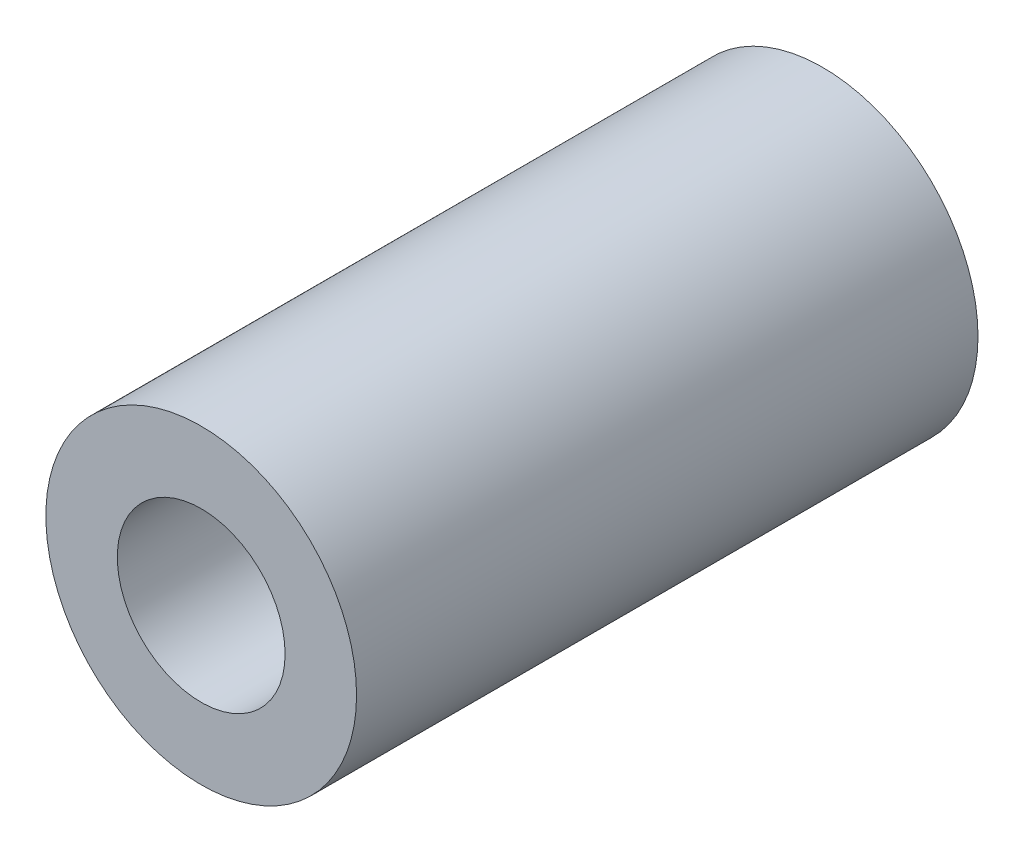
ISO-10303-21;
HEADER;
FILE_DESCRIPTION(('STEP AP214'),'2;1');
FILE_NAME('part.step','',(''),(''),'','','');
FILE_SCHEMA(('AUTOMOTIVE_DESIGN { 1 0 10303 214 1 1 1 1 }'));
ENDSEC;
DATA;
#1=APPLICATION_CONTEXT('core data for automotive mechanical design processes');
#2=APPLICATION_PROTOCOL_DEFINITION('international standard','automotive_design',2000,#1);
#3=PRODUCT_CONTEXT('',#1,'mechanical');
#4=PRODUCT('Part','Part','',(#3));
#5=PRODUCT_RELATED_PRODUCT_CATEGORY('part','',(#4));
#6=PRODUCT_DEFINITION_FORMATION('','',#4);
#7=PRODUCT_DEFINITION_CONTEXT('part definition',#1,'design');
#8=PRODUCT_DEFINITION('design','',#6,#7);
#9=PRODUCT_DEFINITION_SHAPE('','',#8);
#10=(LENGTH_UNIT() NAMED_UNIT(*) SI_UNIT(.MILLI.,.METRE.));
#11=(NAMED_UNIT(*) PLANE_ANGLE_UNIT() SI_UNIT($,.RADIAN.));
#12=(NAMED_UNIT(*) SI_UNIT($,.STERADIAN.) SOLID_ANGLE_UNIT());
#13=UNCERTAINTY_MEASURE_WITH_UNIT(LENGTH_MEASURE(1.E-05),#10,'distance_accuracy_value','');
#14=(GEOMETRIC_REPRESENTATION_CONTEXT(3) GLOBAL_UNCERTAINTY_ASSIGNED_CONTEXT((#13)) GLOBAL_UNIT_ASSIGNED_CONTEXT((#10,
#11,#12)) REPRESENTATION_CONTEXT('',''));
#15=CARTESIAN_POINT('',(0.,0.,0.));
#16=DIRECTION('',(0.,0.,1.));
#17=DIRECTION('',(1.,0.,0.));
#18=AXIS2_PLACEMENT_3D('',#15,#16,#17);
#19=CARTESIAN_POINT('',(0.,0.,10.));
#20=DIRECTION('',(0.,0.,1.));
#21=DIRECTION('',(1.,0.,0.));
#22=AXIS2_PLACEMENT_3D('',#19,#20,#21);
#23=PLANE('',#22);
#24=CARTESIAN_POINT('',(0.,0.,10.));
#25=DIRECTION('',(0.,0.,1.));
#26=DIRECTION('',(1.,0.,0.));
#27=AXIS2_PLACEMENT_3D('',#24,#25,#26);
#28=CIRCLE('',#27,2.5);
#29=CARTESIAN_POINT('',(2.5,0.,10.));
#30=VERTEX_POINT('',#29);
#31=EDGE_CURVE('E10',#30,#30,#28,.T.);
#32=ORIENTED_EDGE('',*,*,#31,.T.);
#33=EDGE_LOOP('',(#32));
#34=FACE_BOUND('',#33,.T.);
#35=CARTESIAN_POINT('',(0.,0.,10.));
#36=DIRECTION('',(0.,0.,1.));
#37=DIRECTION('',(1.,0.,0.));
#38=AXIS2_PLACEMENT_3D('',#35,#36,#37);
#39=CIRCLE('',#38,1.35);
#40=CARTESIAN_POINT('',(1.35,0.,10.));
#41=VERTEX_POINT('',#40);
#42=EDGE_CURVE('E56',#41,#41,#39,.T.);
#43=ORIENTED_EDGE('',*,*,#42,.F.);
#44=EDGE_LOOP('',(#43));
#45=FACE_BOUND('',#44,.T.);
#46=ADVANCED_FACE('F43',(#34,#45),#23,.T.);
#47=CARTESIAN_POINT('',(0.,0.,0.));
#48=DIRECTION('',(0.,0.,1.));
#49=DIRECTION('',(1.,0.,0.));
#50=AXIS2_PLACEMENT_3D('',#47,#48,#49);
#51=PLANE('',#50);
#52=CARTESIAN_POINT('',(0.,0.,0.));
#53=DIRECTION('',(0.,0.,1.));
#54=DIRECTION('',(1.,0.,0.));
#55=AXIS2_PLACEMENT_3D('',#52,#53,#54);
#56=CIRCLE('',#55,2.5);
#57=CARTESIAN_POINT('',(2.5,0.,0.));
#58=VERTEX_POINT('',#57);
#59=EDGE_CURVE('E47',#58,#58,#56,.T.);
#60=ORIENTED_EDGE('',*,*,#59,.F.);
#61=EDGE_LOOP('',(#60));
#62=FACE_BOUND('',#61,.T.);
#63=CARTESIAN_POINT('',(0.,0.,0.));
#64=DIRECTION('',(0.,0.,1.));
#65=DIRECTION('',(1.,0.,0.));
#66=AXIS2_PLACEMENT_3D('',#63,#64,#65);
#67=CIRCLE('',#66,1.35);
#68=CARTESIAN_POINT('',(1.35,0.,0.));
#69=VERTEX_POINT('',#68);
#70=EDGE_CURVE('E58',#69,#69,#67,.T.);
#71=ORIENTED_EDGE('',*,*,#70,.T.);
#72=EDGE_LOOP('',(#71));
#73=FACE_BOUND('',#72,.T.);
#74=ADVANCED_FACE('F70',(#62,#73),#51,.F.);
#75=CARTESIAN_POINT('',(0.,0.,10.));
#76=DIRECTION('',(0.,0.,-1.));
#77=DIRECTION('',(-1.,0.,0.));
#78=AXIS2_PLACEMENT_3D('',#75,#76,#77);
#79=CYLINDRICAL_SURFACE('',#78,2.5);
#80=ORIENTED_EDGE('',*,*,#31,.F.);
#81=EDGE_LOOP('',(#80));
#82=FACE_BOUND('',#81,.T.);
#83=ORIENTED_EDGE('',*,*,#59,.T.);
#84=EDGE_LOOP('',(#83));
#85=FACE_BOUND('',#84,.T.);
#86=ADVANCED_FACE('F45',(#82,#85),#79,.T.);
#87=CARTESIAN_POINT('',(0.,0.,10.));
#88=DIRECTION('',(0.,0.,-1.));
#89=DIRECTION('',(-1.,0.,0.));
#90=AXIS2_PLACEMENT_3D('',#87,#88,#89);
#91=CYLINDRICAL_SURFACE('',#90,1.35);
#92=ORIENTED_EDGE('',*,*,#42,.T.);
#93=EDGE_LOOP('',(#92));
#94=FACE_BOUND('',#93,.T.);
#95=ORIENTED_EDGE('',*,*,#70,.F.);
#96=EDGE_LOOP('',(#95));
#97=FACE_BOUND('',#96,.T.);
#98=ADVANCED_FACE('F66',(#94,#97),#91,.F.);
#99=CLOSED_SHELL('',(#46,#74,#86,#98));
#100=MANIFOLD_SOLID_BREP('B2',#99);
#101=ADVANCED_BREP_SHAPE_REPRESENTATION('',(#18,#100),#14);
#102=SHAPE_DEFINITION_REPRESENTATION(#9,#101);
ENDSEC;
END-ISO-10303-21;
